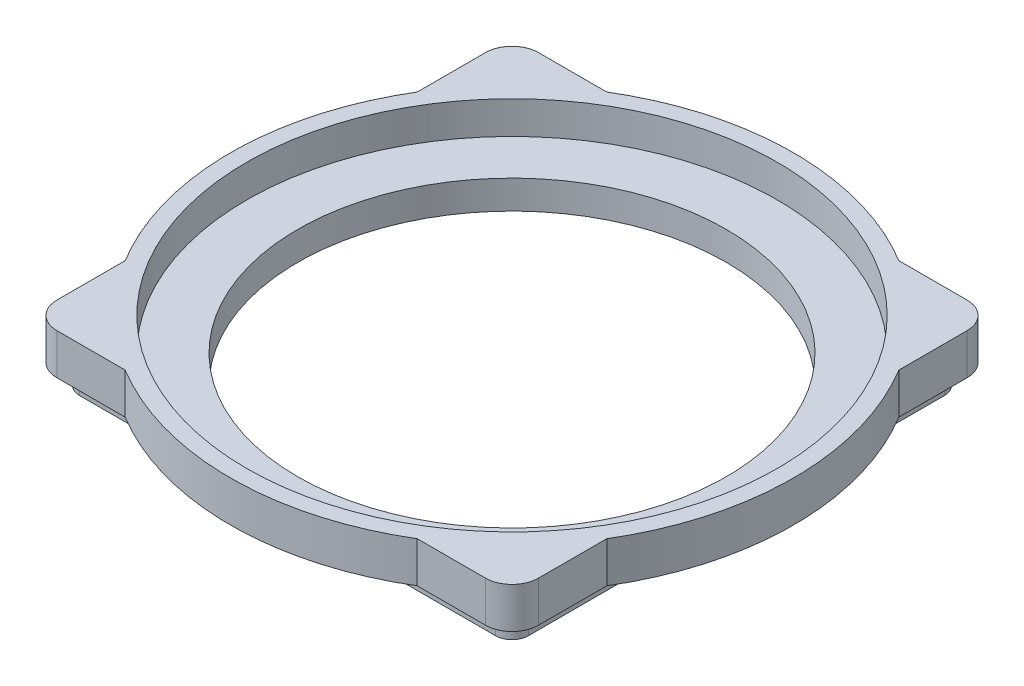
ISO-10303-21;
HEADER;
FILE_DESCRIPTION(('STEP AP214'),'2;1');
FILE_NAME('part.step','',(''),(''),'','','');
FILE_SCHEMA(('AUTOMOTIVE_DESIGN { 1 0 10303 214 1 1 1 1 }'));
ENDSEC;
DATA;
#1=APPLICATION_CONTEXT('core data for automotive mechanical design processes');
#2=APPLICATION_PROTOCOL_DEFINITION('international standard','automotive_design',2000,#1);
#3=PRODUCT_CONTEXT('',#1,'mechanical');
#4=PRODUCT('Part','Part','',(#3));
#5=PRODUCT_RELATED_PRODUCT_CATEGORY('part','',(#4));
#6=PRODUCT_DEFINITION_FORMATION('','',#4);
#7=PRODUCT_DEFINITION_CONTEXT('part definition',#1,'design');
#8=PRODUCT_DEFINITION('design','',#6,#7);
#9=PRODUCT_DEFINITION_SHAPE('','',#8);
#10=(LENGTH_UNIT() NAMED_UNIT(*) SI_UNIT(.MILLI.,.METRE.));
#11=(NAMED_UNIT(*) PLANE_ANGLE_UNIT() SI_UNIT($,.RADIAN.));
#12=(NAMED_UNIT(*) SI_UNIT($,.STERADIAN.) SOLID_ANGLE_UNIT());
#13=UNCERTAINTY_MEASURE_WITH_UNIT(LENGTH_MEASURE(1.E-05),#10,'distance_accuracy_value','');
#14=(GEOMETRIC_REPRESENTATION_CONTEXT(3) GLOBAL_UNCERTAINTY_ASSIGNED_CONTEXT((#13)) GLOBAL_UNIT_ASSIGNED_CONTEXT((#10,
#11,#12)) REPRESENTATION_CONTEXT('',''));
#15=CARTESIAN_POINT('',(0.,0.,0.));
#16=DIRECTION('',(0.,0.,1.));
#17=DIRECTION('',(1.,0.,0.));
#18=AXIS2_PLACEMENT_3D('',#15,#16,#17);
#19=CARTESIAN_POINT('',(0.,0.,0.));
#20=DIRECTION('',(0.,1.,0.));
#21=DIRECTION('',(0.,0.,1.));
#22=AXIS2_PLACEMENT_3D('',#19,#20,#21);
#23=CYLINDRICAL_SURFACE('',#22,52.5);
#24=CARTESIAN_POINT('',(0.,0.,0.));
#25=DIRECTION('',(0.,1.,0.));
#26=DIRECTION('',(0.,0.,1.));
#27=AXIS2_PLACEMENT_3D('',#24,#25,#26);
#28=CIRCLE('',#27,52.5);
#29=CARTESIAN_POINT('',(0.,0.,52.5));
#30=VERTEX_POINT('',#29);
#31=EDGE_CURVE('E257',#30,#30,#28,.T.);
#32=ORIENTED_EDGE('',*,*,#31,.F.);
#33=EDGE_LOOP('',(#32));
#34=FACE_BOUND('',#33,.T.);
#35=CARTESIAN_POINT('',(0.,7.,0.));
#36=DIRECTION('',(0.,1.,0.));
#37=DIRECTION('',(0.,0.,1.));
#38=AXIS2_PLACEMENT_3D('',#35,#36,#37);
#39=CIRCLE('',#38,52.5);
#40=CARTESIAN_POINT('',(0.,7.,52.5));
#41=VERTEX_POINT('',#40);
#42=EDGE_CURVE('E254',#41,#41,#39,.F.);
#43=ORIENTED_EDGE('',*,*,#42,.F.);
#44=EDGE_LOOP('',(#43));
#45=FACE_BOUND('',#44,.T.);
#46=ADVANCED_FACE('F37',(#34,#45),#23,.F.);
#47=CARTESIAN_POINT('',(-59.,15.,-59.));
#48=DIRECTION('',(1.,0.,0.));
#49=DIRECTION('',(0.,0.,-1.));
#50=AXIS2_PLACEMENT_3D('',#47,#48,#49);
#51=PLANE('',#50);
#52=DIRECTION('',(0.,0.,1.));
#53=VECTOR('',#52,1.);
#54=CARTESIAN_POINT('',(-59.,15.,-59.));
#55=LINE('',#54,#53);
#56=CARTESIAN_POINT('',(-59.,15.,-52.5));
#57=VERTEX_POINT('',#56);
#58=CARTESIAN_POINT('',(-59.,15.,-35.7770876399966));
#59=VERTEX_POINT('',#58);
#60=EDGE_CURVE('E242',#57,#59,#55,.T.);
#61=ORIENTED_EDGE('',*,*,#60,.F.);
#62=DIRECTION('',(0.,-1.,0.));
#63=VECTOR('',#62,1.);
#64=CARTESIAN_POINT('',(-59.,15.,-52.5));
#65=LINE('',#64,#63);
#66=CARTESIAN_POINT('',(-59.,5.,-52.5));
#67=VERTEX_POINT('',#66);
#68=EDGE_CURVE('E228',#57,#67,#65,.T.);
#69=ORIENTED_EDGE('',*,*,#68,.T.);
#70=DIRECTION('',(0.,0.,-1.));
#71=VECTOR('',#70,1.);
#72=CARTESIAN_POINT('',(-59.,5.,59.));
#73=LINE('',#72,#71);
#74=CARTESIAN_POINT('',(-59.,5.,-35.7770876399966));
#75=VERTEX_POINT('',#74);
#76=EDGE_CURVE('E218',#75,#67,#73,.T.);
#77=ORIENTED_EDGE('',*,*,#76,.F.);
#78=DIRECTION('',(0.,1.,0.));
#79=VECTOR('',#78,1.);
#80=CARTESIAN_POINT('',(-59.,-190.161471607487,-35.7770876399966));
#81=LINE('',#80,#79);
#82=EDGE_CURVE('E201',#75,#59,#81,.T.);
#83=ORIENTED_EDGE('',*,*,#82,.T.);
#84=EDGE_LOOP('',(#61,#69,#77,#83));
#85=FACE_BOUND('',#84,.T.);
#86=ADVANCED_FACE('F226',(#85),#51,.F.);
#87=CARTESIAN_POINT('',(59.,15.,59.));
#88=DIRECTION('',(0.,0.,-1.));
#89=DIRECTION('',(-1.,0.,0.));
#90=AXIS2_PLACEMENT_3D('',#87,#88,#89);
#91=PLANE('',#90);
#92=DIRECTION('',(1.,0.,0.));
#93=VECTOR('',#92,1.);
#94=CARTESIAN_POINT('',(59.,15.,59.));
#95=LINE('',#94,#93);
#96=CARTESIAN_POINT('',(-52.5,15.,59.));
#97=VERTEX_POINT('',#96);
#98=CARTESIAN_POINT('',(-35.7770876399965,15.,59.));
#99=VERTEX_POINT('',#98);
#100=EDGE_CURVE('E245',#97,#99,#95,.T.);
#101=ORIENTED_EDGE('',*,*,#100,.F.);
#102=DIRECTION('',(0.,-1.,0.));
#103=VECTOR('',#102,1.);
#104=CARTESIAN_POINT('',(-52.5,15.,59.));
#105=LINE('',#104,#103);
#106=CARTESIAN_POINT('',(-52.5,5.,59.));
#107=VERTEX_POINT('',#106);
#108=EDGE_CURVE('E294',#97,#107,#105,.T.);
#109=ORIENTED_EDGE('',*,*,#108,.T.);
#110=DIRECTION('',(-1.,0.,0.));
#111=VECTOR('',#110,1.);
#112=CARTESIAN_POINT('',(59.,5.,59.));
#113=LINE('',#112,#111);
#114=CARTESIAN_POINT('',(-35.7770876399965,5.,59.));
#115=VERTEX_POINT('',#114);
#116=EDGE_CURVE('E232',#115,#107,#113,.T.);
#117=ORIENTED_EDGE('',*,*,#116,.F.);
#118=DIRECTION('',(0.,1.,0.));
#119=VECTOR('',#118,1.);
#120=CARTESIAN_POINT('',(-35.7770876399965,-190.161471607487,59.));
#121=LINE('',#120,#119);
#122=EDGE_CURVE('E354',#115,#99,#121,.T.);
#123=ORIENTED_EDGE('',*,*,#122,.T.);
#124=EDGE_LOOP('',(#101,#109,#117,#123));
#125=FACE_BOUND('',#124,.T.);
#126=ADVANCED_FACE('F433',(#125),#91,.F.);
#127=CARTESIAN_POINT('',(59.,15.,-59.));
#128=DIRECTION('',(-1.,0.,0.));
#129=DIRECTION('',(0.,0.,1.));
#130=AXIS2_PLACEMENT_3D('',#127,#128,#129);
#131=PLANE('',#130);
#132=DIRECTION('',(0.,0.,-1.));
#133=VECTOR('',#132,1.);
#134=CARTESIAN_POINT('',(59.,15.,-59.));
#135=LINE('',#134,#133);
#136=CARTESIAN_POINT('',(59.,15.,52.5));
#137=VERTEX_POINT('',#136);
#138=CARTESIAN_POINT('',(59.,15.,35.7770876399966));
#139=VERTEX_POINT('',#138);
#140=EDGE_CURVE('E248',#137,#139,#135,.T.);
#141=ORIENTED_EDGE('',*,*,#140,.F.);
#142=DIRECTION('',(0.,-1.,0.));
#143=VECTOR('',#142,1.);
#144=CARTESIAN_POINT('',(59.,15.,52.5));
#145=LINE('',#144,#143);
#146=CARTESIAN_POINT('',(59.,5.,52.5));
#147=VERTEX_POINT('',#146);
#148=EDGE_CURVE('E316',#137,#147,#145,.T.);
#149=ORIENTED_EDGE('',*,*,#148,.T.);
#150=DIRECTION('',(0.,0.,1.));
#151=VECTOR('',#150,1.);
#152=CARTESIAN_POINT('',(59.,5.,-59.));
#153=LINE('',#152,#151);
#154=CARTESIAN_POINT('',(59.,5.,35.7770876399966));
#155=VERTEX_POINT('',#154);
#156=EDGE_CURVE('E238',#155,#147,#153,.T.);
#157=ORIENTED_EDGE('',*,*,#156,.F.);
#158=DIRECTION('',(0.,1.,0.));
#159=VECTOR('',#158,1.);
#160=CARTESIAN_POINT('',(59.,-190.161471607487,35.7770876399966));
#161=LINE('',#160,#159);
#162=EDGE_CURVE('E348',#155,#139,#161,.T.);
#163=ORIENTED_EDGE('',*,*,#162,.T.);
#164=EDGE_LOOP('',(#141,#149,#157,#163));
#165=FACE_BOUND('',#164,.T.);
#166=ADVANCED_FACE('F471',(#165),#131,.F.);
#167=CARTESIAN_POINT('',(59.,15.,-59.));
#168=DIRECTION('',(0.,0.,1.));
#169=DIRECTION('',(1.,0.,0.));
#170=AXIS2_PLACEMENT_3D('',#167,#168,#169);
#171=PLANE('',#170);
#172=DIRECTION('',(-1.,0.,0.));
#173=VECTOR('',#172,1.);
#174=CARTESIAN_POINT('',(59.,15.,-59.));
#175=LINE('',#174,#173);
#176=CARTESIAN_POINT('',(52.5,15.,-59.));
#177=VERTEX_POINT('',#176);
#178=CARTESIAN_POINT('',(35.7770876399966,15.,-59.));
#179=VERTEX_POINT('',#178);
#180=EDGE_CURVE('E251',#177,#179,#175,.T.);
#181=ORIENTED_EDGE('',*,*,#180,.F.);
#182=DIRECTION('',(0.,-1.,0.));
#183=VECTOR('',#182,1.);
#184=CARTESIAN_POINT('',(52.5,15.,-59.));
#185=LINE('',#184,#183);
#186=CARTESIAN_POINT('',(52.5,5.,-59.));
#187=VERTEX_POINT('',#186);
#188=EDGE_CURVE('E45',#177,#187,#185,.T.);
#189=ORIENTED_EDGE('',*,*,#188,.T.);
#190=DIRECTION('',(1.,0.,0.));
#191=VECTOR('',#190,1.);
#192=CARTESIAN_POINT('',(-59.,5.,-59.));
#193=LINE('',#192,#191);
#194=CARTESIAN_POINT('',(35.7770876399966,5.,-59.));
#195=VERTEX_POINT('',#194);
#196=EDGE_CURVE('E231',#195,#187,#193,.T.);
#197=ORIENTED_EDGE('',*,*,#196,.F.);
#198=DIRECTION('',(0.,1.,0.));
#199=VECTOR('',#198,1.);
#200=CARTESIAN_POINT('',(35.7770876399966,-190.161471607487,-59.));
#201=LINE('',#200,#199);
#202=EDGE_CURVE('E343',#195,#179,#201,.T.);
#203=ORIENTED_EDGE('',*,*,#202,.T.);
#204=EDGE_LOOP('',(#181,#189,#197,#203));
#205=FACE_BOUND('',#204,.T.);
#206=ADVANCED_FACE('F325',(#205),#171,.F.);
#207=CARTESIAN_POINT('',(-59.,5.,52.5000000000001));
#208=VERTEX_POINT('',#207);
#209=CARTESIAN_POINT('',(-59.,5.,35.7770876399966));
#210=VERTEX_POINT('',#209);
#211=EDGE_CURVE('E220',#208,#210,#73,.T.);
#212=ORIENTED_EDGE('',*,*,#211,.F.);
#213=DIRECTION('',(0.,-1.,0.));
#214=VECTOR('',#213,1.);
#215=CARTESIAN_POINT('',(-59.,15.,52.5));
#216=LINE('',#215,#214);
#217=CARTESIAN_POINT('',(-59.,15.,52.5));
#218=VERTEX_POINT('',#217);
#219=EDGE_CURVE('E305',#208,#218,#216,.F.);
#220=ORIENTED_EDGE('',*,*,#219,.T.);
#221=CARTESIAN_POINT('',(-59.,15.,35.7770876399966));
#222=VERTEX_POINT('',#221);
#223=EDGE_CURVE('E241',#222,#218,#55,.T.);
#224=ORIENTED_EDGE('',*,*,#223,.F.);
#225=DIRECTION('',(0.,1.,0.));
#226=VECTOR('',#225,1.);
#227=CARTESIAN_POINT('',(-59.,-190.161471607487,35.7770876399966));
#228=LINE('',#227,#226);
#229=EDGE_CURVE('E212',#222,#210,#228,.F.);
#230=ORIENTED_EDGE('',*,*,#229,.T.);
#231=EDGE_LOOP('',(#212,#220,#224,#230));
#232=FACE_BOUND('',#231,.T.);
#233=ADVANCED_FACE('F435',(#232),#51,.F.);
#234=CARTESIAN_POINT('',(52.5,5.,59.));
#235=VERTEX_POINT('',#234);
#236=CARTESIAN_POINT('',(35.7770876399966,5.,59.));
#237=VERTEX_POINT('',#236);
#238=EDGE_CURVE('E229',#235,#237,#113,.T.);
#239=ORIENTED_EDGE('',*,*,#238,.F.);
#240=DIRECTION('',(0.,-1.,0.));
#241=VECTOR('',#240,1.);
#242=CARTESIAN_POINT('',(52.5,15.,59.));
#243=LINE('',#242,#241);
#244=CARTESIAN_POINT('',(52.5,15.,59.));
#245=VERTEX_POINT('',#244);
#246=EDGE_CURVE('E319',#235,#245,#243,.F.);
#247=ORIENTED_EDGE('',*,*,#246,.T.);
#248=CARTESIAN_POINT('',(35.7770876399966,15.,59.));
#249=VERTEX_POINT('',#248);
#250=EDGE_CURVE('E244',#249,#245,#95,.T.);
#251=ORIENTED_EDGE('',*,*,#250,.F.);
#252=DIRECTION('',(0.,1.,0.));
#253=VECTOR('',#252,1.);
#254=CARTESIAN_POINT('',(35.7770876399966,-190.161471607487,59.));
#255=LINE('',#254,#253);
#256=EDGE_CURVE('E351',#249,#237,#255,.F.);
#257=ORIENTED_EDGE('',*,*,#256,.T.);
#258=EDGE_LOOP('',(#239,#247,#251,#257));
#259=FACE_BOUND('',#258,.T.);
#260=ADVANCED_FACE('F469',(#259),#91,.F.);
#261=CARTESIAN_POINT('',(59.,5.,-52.5));
#262=VERTEX_POINT('',#261);
#263=CARTESIAN_POINT('',(59.,5.,-35.7770876399966));
#264=VERTEX_POINT('',#263);
#265=EDGE_CURVE('E239',#262,#264,#153,.T.);
#266=ORIENTED_EDGE('',*,*,#265,.F.);
#267=DIRECTION('',(0.,-1.,0.));
#268=VECTOR('',#267,1.);
#269=CARTESIAN_POINT('',(59.,15.,-52.5));
#270=LINE('',#269,#268);
#271=CARTESIAN_POINT('',(59.,15.,-52.5));
#272=VERTEX_POINT('',#271);
#273=EDGE_CURVE('E11',#262,#272,#270,.F.);
#274=ORIENTED_EDGE('',*,*,#273,.T.);
#275=CARTESIAN_POINT('',(59.,15.,-35.7770876399966));
#276=VERTEX_POINT('',#275);
#277=EDGE_CURVE('E247',#276,#272,#135,.T.);
#278=ORIENTED_EDGE('',*,*,#277,.F.);
#279=DIRECTION('',(0.,1.,0.));
#280=VECTOR('',#279,1.);
#281=CARTESIAN_POINT('',(59.,-190.161471607487,-35.7770876399966));
#282=LINE('',#281,#280);
#283=EDGE_CURVE('E345',#276,#264,#282,.F.);
#284=ORIENTED_EDGE('',*,*,#283,.T.);
#285=EDGE_LOOP('',(#266,#274,#278,#284));
#286=FACE_BOUND('',#285,.T.);
#287=ADVANCED_FACE('F466',(#286),#131,.F.);
#288=CARTESIAN_POINT('',(-52.5,5.,-59.));
#289=VERTEX_POINT('',#288);
#290=CARTESIAN_POINT('',(-35.7770876399967,5.,-59.));
#291=VERTEX_POINT('',#290);
#292=EDGE_CURVE('E236',#289,#291,#193,.T.);
#293=ORIENTED_EDGE('',*,*,#292,.F.);
#294=DIRECTION('',(0.,-1.,0.));
#295=VECTOR('',#294,1.);
#296=CARTESIAN_POINT('',(-52.5,15.,-59.));
#297=LINE('',#296,#295);
#298=CARTESIAN_POINT('',(-52.5,15.,-59.));
#299=VERTEX_POINT('',#298);
#300=EDGE_CURVE('E52',#289,#299,#297,.F.);
#301=ORIENTED_EDGE('',*,*,#300,.T.);
#302=CARTESIAN_POINT('',(-35.7770876399967,15.,-59.));
#303=VERTEX_POINT('',#302);
#304=EDGE_CURVE('E250',#303,#299,#175,.T.);
#305=ORIENTED_EDGE('',*,*,#304,.F.);
#306=DIRECTION('',(0.,1.,0.));
#307=VECTOR('',#306,1.);
#308=CARTESIAN_POINT('',(-35.7770876399967,-190.161471607487,-59.));
#309=LINE('',#308,#307);
#310=EDGE_CURVE('E221',#303,#291,#309,.F.);
#311=ORIENTED_EDGE('',*,*,#310,.T.);
#312=EDGE_LOOP('',(#293,#301,#305,#311));
#313=FACE_BOUND('',#312,.T.);
#314=ADVANCED_FACE('F459',(#313),#171,.F.);
#315=CARTESIAN_POINT('',(0.,15.,0.));
#316=DIRECTION('',(0.,-1.,0.));
#317=DIRECTION('',(0.,0.,-1.));
#318=AXIS2_PLACEMENT_3D('',#315,#316,#317);
#319=PLANE('',#318);
#320=CARTESIAN_POINT('',(0.,15.,0.));
#321=DIRECTION('',(0.,1.,0.));
#322=DIRECTION('',(0.,0.,1.));
#323=AXIS2_PLACEMENT_3D('',#320,#321,#322);
#324=CIRCLE('',#323,65.);
#325=CARTESIAN_POINT('',(0.,15.,65.));
#326=VERTEX_POINT('',#325);
#327=EDGE_CURVE('E715',#326,#326,#324,.T.);
#328=ORIENTED_EDGE('',*,*,#327,.F.);
#329=EDGE_LOOP('',(#328));
#330=FACE_BOUND('',#329,.T.);
#331=ORIENTED_EDGE('',*,*,#223,.T.);
#332=CARTESIAN_POINT('',(-52.5,15.,52.5000000000001));
#333=DIRECTION('',(0.,-1.,0.));
#334=DIRECTION('',(0.,0.,-1.));
#335=AXIS2_PLACEMENT_3D('',#332,#333,#334);
#336=CIRCLE('',#335,6.5);
#337=EDGE_CURVE('E312',#218,#97,#336,.F.);
#338=ORIENTED_EDGE('',*,*,#337,.T.);
#339=ORIENTED_EDGE('',*,*,#100,.T.);
#340=CARTESIAN_POINT('',(0.,15.,0.));
#341=DIRECTION('',(0.,1.,0.));
#342=DIRECTION('',(0.,0.,1.));
#343=AXIS2_PLACEMENT_3D('',#340,#341,#342);
#344=CIRCLE('',#343,69.);
#345=EDGE_CURVE('E339',#99,#249,#344,.T.);
#346=ORIENTED_EDGE('',*,*,#345,.T.);
#347=ORIENTED_EDGE('',*,*,#250,.T.);
#348=CARTESIAN_POINT('',(52.5,15.,52.5));
#349=DIRECTION('',(0.,-1.,0.));
#350=DIRECTION('',(0.,0.,-1.));
#351=AXIS2_PLACEMENT_3D('',#348,#349,#350);
#352=CIRCLE('',#351,6.5);
#353=EDGE_CURVE('E308',#245,#137,#352,.F.);
#354=ORIENTED_EDGE('',*,*,#353,.T.);
#355=ORIENTED_EDGE('',*,*,#140,.T.);
#356=EDGE_CURVE('E334',#139,#276,#344,.T.);
#357=ORIENTED_EDGE('',*,*,#356,.T.);
#358=ORIENTED_EDGE('',*,*,#277,.T.);
#359=CARTESIAN_POINT('',(52.5,15.,-52.5));
#360=DIRECTION('',(0.,-1.,0.));
#361=DIRECTION('',(0.,0.,-1.));
#362=AXIS2_PLACEMENT_3D('',#359,#360,#361);
#363=CIRCLE('',#362,6.5);
#364=EDGE_CURVE('E60',#272,#177,#363,.F.);
#365=ORIENTED_EDGE('',*,*,#364,.T.);
#366=ORIENTED_EDGE('',*,*,#180,.T.);
#367=EDGE_CURVE('E337',#179,#303,#344,.T.);
#368=ORIENTED_EDGE('',*,*,#367,.T.);
#369=ORIENTED_EDGE('',*,*,#304,.T.);
#370=CARTESIAN_POINT('',(-52.5,15.,-52.5));
#371=DIRECTION('',(0.,-1.,0.));
#372=DIRECTION('',(0.,0.,-1.));
#373=AXIS2_PLACEMENT_3D('',#370,#371,#372);
#374=CIRCLE('',#373,6.5);
#375=EDGE_CURVE('E310',#299,#57,#374,.F.);
#376=ORIENTED_EDGE('',*,*,#375,.T.);
#377=ORIENTED_EDGE('',*,*,#60,.T.);
#378=EDGE_CURVE('E207',#59,#222,#344,.T.);
#379=ORIENTED_EDGE('',*,*,#378,.T.);
#380=EDGE_LOOP('',(#331,#338,#339,#346,#347,#354,#355,#357,#358,#365,#366,#368,#369,#376,#377,#379));
#381=FACE_BOUND('',#380,.T.);
#382=ADVANCED_FACE('F456',(#330,#381),#319,.F.);
#383=CARTESIAN_POINT('',(0.,5.,0.));
#384=DIRECTION('',(0.,-1.,0.));
#385=DIRECTION('',(0.,0.,-1.));
#386=AXIS2_PLACEMENT_3D('',#383,#384,#385);
#387=PLANE('',#386);
#388=DIRECTION('',(0.,0.,1.));
#389=VECTOR('',#388,1.);
#390=CARTESIAN_POINT('',(55.,5.,-55.));
#391=LINE('',#390,#389);
#392=CARTESIAN_POINT('',(55.,5.,-51.));
#393=VERTEX_POINT('',#392);
#394=CARTESIAN_POINT('',(55.,5.,51.));
#395=VERTEX_POINT('',#394);
#396=EDGE_CURVE('E358',#393,#395,#391,.T.);
#397=ORIENTED_EDGE('',*,*,#396,.F.);
#398=CARTESIAN_POINT('',(51.,5.,-51.));
#399=DIRECTION('',(0.,-1.,0.));
#400=DIRECTION('',(0.,0.,-1.));
#401=AXIS2_PLACEMENT_3D('',#398,#399,#400);
#402=CIRCLE('',#401,4.);
#403=CARTESIAN_POINT('',(51.,5.,-55.));
#404=VERTEX_POINT('',#403);
#405=EDGE_CURVE('E288',#393,#404,#402,.F.);
#406=ORIENTED_EDGE('',*,*,#405,.T.);
#407=DIRECTION('',(1.,0.,0.));
#408=VECTOR('',#407,1.);
#409=CARTESIAN_POINT('',(-55.,5.,-55.));
#410=LINE('',#409,#408);
#411=CARTESIAN_POINT('',(-51.,5.,-55.));
#412=VERTEX_POINT('',#411);
#413=EDGE_CURVE('E368',#412,#404,#410,.T.);
#414=ORIENTED_EDGE('',*,*,#413,.F.);
#415=CARTESIAN_POINT('',(-51.,5.,-51.));
#416=DIRECTION('',(0.,-1.,0.));
#417=DIRECTION('',(0.,0.,-1.));
#418=AXIS2_PLACEMENT_3D('',#415,#416,#417);
#419=CIRCLE('',#418,4.);
#420=CARTESIAN_POINT('',(-55.,5.,-51.));
#421=VERTEX_POINT('',#420);
#422=EDGE_CURVE('E286',#412,#421,#419,.F.);
#423=ORIENTED_EDGE('',*,*,#422,.T.);
#424=DIRECTION('',(0.,0.,-1.));
#425=VECTOR('',#424,1.);
#426=CARTESIAN_POINT('',(-55.,5.,-55.));
#427=LINE('',#426,#425);
#428=CARTESIAN_POINT('',(-55.,5.,51.));
#429=VERTEX_POINT('',#428);
#430=EDGE_CURVE('E365',#429,#421,#427,.T.);
#431=ORIENTED_EDGE('',*,*,#430,.F.);
#432=CARTESIAN_POINT('',(-51.,5.,51.));
#433=DIRECTION('',(0.,-1.,0.));
#434=DIRECTION('',(0.,0.,-1.));
#435=AXIS2_PLACEMENT_3D('',#432,#433,#434);
#436=CIRCLE('',#435,4.);
#437=CARTESIAN_POINT('',(-51.,5.,55.));
#438=VERTEX_POINT('',#437);
#439=EDGE_CURVE('E292',#429,#438,#436,.F.);
#440=ORIENTED_EDGE('',*,*,#439,.T.);
#441=DIRECTION('',(-1.,0.,0.));
#442=VECTOR('',#441,1.);
#443=CARTESIAN_POINT('',(-55.,5.,55.));
#444=LINE('',#443,#442);
#445=CARTESIAN_POINT('',(51.,5.,55.));
#446=VERTEX_POINT('',#445);
#447=EDGE_CURVE('E361',#446,#438,#444,.T.);
#448=ORIENTED_EDGE('',*,*,#447,.F.);
#449=CARTESIAN_POINT('',(51.,5.,51.));
#450=DIRECTION('',(0.,-1.,0.));
#451=DIRECTION('',(0.,0.,-1.));
#452=AXIS2_PLACEMENT_3D('',#449,#450,#451);
#453=CIRCLE('',#452,4.);
#454=EDGE_CURVE('E290',#446,#395,#453,.F.);
#455=ORIENTED_EDGE('',*,*,#454,.T.);
#456=EDGE_LOOP('',(#397,#406,#414,#423,#431,#440,#448,#455));
#457=FACE_BOUND('',#456,.T.);
#458=ORIENTED_EDGE('',*,*,#116,.T.);
#459=CARTESIAN_POINT('',(-52.5,5.,52.5000000000001));
#460=DIRECTION('',(0.,-1.,0.));
#461=DIRECTION('',(0.,0.,-1.));
#462=AXIS2_PLACEMENT_3D('',#459,#460,#461);
#463=CIRCLE('',#462,6.5);
#464=EDGE_CURVE('E303',#107,#208,#463,.T.);
#465=ORIENTED_EDGE('',*,*,#464,.T.);
#466=ORIENTED_EDGE('',*,*,#211,.T.);
#467=CARTESIAN_POINT('',(0.,5.,0.));
#468=DIRECTION('',(0.,-1.,0.));
#469=DIRECTION('',(0.,0.,-1.));
#470=AXIS2_PLACEMENT_3D('',#467,#468,#469);
#471=CIRCLE('',#470,69.);
#472=EDGE_CURVE('E204',#75,#210,#471,.F.);
#473=ORIENTED_EDGE('',*,*,#472,.F.);
#474=ORIENTED_EDGE('',*,*,#76,.T.);
#475=CARTESIAN_POINT('',(-52.5,5.,-52.5));
#476=DIRECTION('',(0.,-1.,0.));
#477=DIRECTION('',(0.,0.,-1.));
#478=AXIS2_PLACEMENT_3D('',#475,#476,#477);
#479=CIRCLE('',#478,6.5);
#480=EDGE_CURVE('E301',#67,#289,#479,.T.);
#481=ORIENTED_EDGE('',*,*,#480,.T.);
#482=ORIENTED_EDGE('',*,*,#292,.T.);
#483=EDGE_CURVE('E224',#195,#291,#471,.F.);
#484=ORIENTED_EDGE('',*,*,#483,.F.);
#485=ORIENTED_EDGE('',*,*,#196,.T.);
#486=CARTESIAN_POINT('',(52.5,5.,-52.5));
#487=DIRECTION('',(0.,-1.,0.));
#488=DIRECTION('',(0.,0.,-1.));
#489=AXIS2_PLACEMENT_3D('',#486,#487,#488);
#490=CIRCLE('',#489,6.5);
#491=EDGE_CURVE('E297',#187,#262,#490,.T.);
#492=ORIENTED_EDGE('',*,*,#491,.T.);
#493=ORIENTED_EDGE('',*,*,#265,.T.);
#494=EDGE_CURVE('E333',#155,#264,#471,.F.);
#495=ORIENTED_EDGE('',*,*,#494,.F.);
#496=ORIENTED_EDGE('',*,*,#156,.T.);
#497=CARTESIAN_POINT('',(52.5,5.,52.5));
#498=DIRECTION('',(0.,-1.,0.));
#499=DIRECTION('',(0.,0.,-1.));
#500=AXIS2_PLACEMENT_3D('',#497,#498,#499);
#501=CIRCLE('',#500,6.5);
#502=EDGE_CURVE('E299',#147,#235,#501,.T.);
#503=ORIENTED_EDGE('',*,*,#502,.T.);
#504=ORIENTED_EDGE('',*,*,#238,.T.);
#505=EDGE_CURVE('E222',#115,#237,#471,.F.);
#506=ORIENTED_EDGE('',*,*,#505,.F.);
#507=EDGE_LOOP('',(#458,#465,#466,#473,#474,#481,#482,#484,#485,#492,#493,#495,#496,#503,#504,#506));
#508=FACE_BOUND('',#507,.T.);
#509=ADVANCED_FACE('F217',(#457,#508),#387,.T.);
#510=CARTESIAN_POINT('',(55.,5.,-55.));
#511=DIRECTION('',(1.,0.,0.));
#512=DIRECTION('',(0.,0.,-1.));
#513=AXIS2_PLACEMENT_3D('',#510,#511,#512);
#514=PLANE('',#513);
#515=DIRECTION('',(0.,0.,1.));
#516=VECTOR('',#515,1.);
#517=CARTESIAN_POINT('',(55.,0.,-55.));
#518=LINE('',#517,#516);
#519=CARTESIAN_POINT('',(55.,0.,-51.));
#520=VERTEX_POINT('',#519);
#521=CARTESIAN_POINT('',(55.,0.,51.));
#522=VERTEX_POINT('',#521);
#523=EDGE_CURVE('E211',#520,#522,#518,.T.);
#524=ORIENTED_EDGE('',*,*,#523,.F.);
#525=DIRECTION('',(0.,-1.,0.));
#526=VECTOR('',#525,1.);
#527=CARTESIAN_POINT('',(55.,5.,-51.));
#528=LINE('',#527,#526);
#529=EDGE_CURVE('E279',#520,#393,#528,.F.);
#530=ORIENTED_EDGE('',*,*,#529,.T.);
#531=ORIENTED_EDGE('',*,*,#396,.T.);
#532=DIRECTION('',(0.,-1.,0.));
#533=VECTOR('',#532,1.);
#534=CARTESIAN_POINT('',(55.,5.,51.));
#535=LINE('',#534,#533);
#536=EDGE_CURVE('E276',#395,#522,#535,.T.);
#537=ORIENTED_EDGE('',*,*,#536,.T.);
#538=EDGE_LOOP('',(#524,#530,#531,#537));
#539=FACE_BOUND('',#538,.T.);
#540=ADVANCED_FACE('F414',(#539),#514,.T.);
#541=CARTESIAN_POINT('',(-55.,5.,-55.));
#542=DIRECTION('',(0.,0.,-1.));
#543=DIRECTION('',(-1.,0.,0.));
#544=AXIS2_PLACEMENT_3D('',#541,#542,#543);
#545=PLANE('',#544);
#546=DIRECTION('',(1.,0.,0.));
#547=VECTOR('',#546,1.);
#548=CARTESIAN_POINT('',(-55.,0.,-55.));
#549=LINE('',#548,#547);
#550=CARTESIAN_POINT('',(-51.,0.,-55.));
#551=VERTEX_POINT('',#550);
#552=CARTESIAN_POINT('',(51.,0.,-55.));
#553=VERTEX_POINT('',#552);
#554=EDGE_CURVE('E362',#551,#553,#549,.T.);
#555=ORIENTED_EDGE('',*,*,#554,.F.);
#556=DIRECTION('',(0.,-1.,0.));
#557=VECTOR('',#556,1.);
#558=CARTESIAN_POINT('',(-51.,5.,-55.));
#559=LINE('',#558,#557);
#560=EDGE_CURVE('E274',#551,#412,#559,.F.);
#561=ORIENTED_EDGE('',*,*,#560,.T.);
#562=ORIENTED_EDGE('',*,*,#413,.T.);
#563=DIRECTION('',(0.,-1.,0.));
#564=VECTOR('',#563,1.);
#565=CARTESIAN_POINT('',(51.,5.,-55.));
#566=LINE('',#565,#564);
#567=EDGE_CURVE('E271',#404,#553,#566,.T.);
#568=ORIENTED_EDGE('',*,*,#567,.T.);
#569=EDGE_LOOP('',(#555,#561,#562,#568));
#570=FACE_BOUND('',#569,.T.);
#571=ADVANCED_FACE('F385',(#570),#545,.T.);
#572=CARTESIAN_POINT('',(-55.,5.,-55.));
#573=DIRECTION('',(-1.,0.,0.));
#574=DIRECTION('',(0.,0.,1.));
#575=AXIS2_PLACEMENT_3D('',#572,#573,#574);
#576=PLANE('',#575);
#577=ORIENTED_EDGE('',*,*,#430,.T.);
#578=DIRECTION('',(0.,-1.,0.));
#579=VECTOR('',#578,1.);
#580=CARTESIAN_POINT('',(-55.,5.,-51.));
#581=LINE('',#580,#579);
#582=CARTESIAN_POINT('',(-55.,0.,-51.));
#583=VERTEX_POINT('',#582);
#584=EDGE_CURVE('E260',#421,#583,#581,.T.);
#585=ORIENTED_EDGE('',*,*,#584,.T.);
#586=DIRECTION('',(0.,0.,-1.));
#587=VECTOR('',#586,1.);
#588=CARTESIAN_POINT('',(-55.,0.,-55.));
#589=LINE('',#588,#587);
#590=CARTESIAN_POINT('',(-55.,0.,51.));
#591=VERTEX_POINT('',#590);
#592=EDGE_CURVE('E376',#591,#583,#589,.T.);
#593=ORIENTED_EDGE('',*,*,#592,.F.);
#594=DIRECTION('',(0.,-1.,0.));
#595=VECTOR('',#594,1.);
#596=CARTESIAN_POINT('',(-55.,5.,51.));
#597=LINE('',#596,#595);
#598=EDGE_CURVE('E253',#591,#429,#597,.F.);
#599=ORIENTED_EDGE('',*,*,#598,.T.);
#600=EDGE_LOOP('',(#577,#585,#593,#599));
#601=FACE_BOUND('',#600,.T.);
#602=ADVANCED_FACE('F397',(#601),#576,.T.);
#603=CARTESIAN_POINT('',(-55.,5.,55.));
#604=DIRECTION('',(0.,0.,1.));
#605=DIRECTION('',(1.,0.,0.));
#606=AXIS2_PLACEMENT_3D('',#603,#604,#605);
#607=PLANE('',#606);
#608=DIRECTION('',(-1.,0.,0.));
#609=VECTOR('',#608,1.);
#610=CARTESIAN_POINT('',(-55.,0.,55.));
#611=LINE('',#610,#609);
#612=CARTESIAN_POINT('',(51.,0.,55.));
#613=VERTEX_POINT('',#612);
#614=CARTESIAN_POINT('',(-51.,0.,55.));
#615=VERTEX_POINT('',#614);
#616=EDGE_CURVE('E373',#613,#615,#611,.T.);
#617=ORIENTED_EDGE('',*,*,#616,.F.);
#618=DIRECTION('',(0.,-1.,0.));
#619=VECTOR('',#618,1.);
#620=CARTESIAN_POINT('',(51.,5.,55.));
#621=LINE('',#620,#619);
#622=EDGE_CURVE('E284',#613,#446,#621,.F.);
#623=ORIENTED_EDGE('',*,*,#622,.T.);
#624=ORIENTED_EDGE('',*,*,#447,.T.);
#625=DIRECTION('',(0.,-1.,0.));
#626=VECTOR('',#625,1.);
#627=CARTESIAN_POINT('',(-51.,5.,55.));
#628=LINE('',#627,#626);
#629=EDGE_CURVE('E281',#438,#615,#628,.T.);
#630=ORIENTED_EDGE('',*,*,#629,.T.);
#631=EDGE_LOOP('',(#617,#623,#624,#630));
#632=FACE_BOUND('',#631,.T.);
#633=ADVANCED_FACE('F407',(#632),#607,.T.);
#634=CARTESIAN_POINT('',(0.,0.,0.));
#635=DIRECTION('',(0.,-1.,0.));
#636=DIRECTION('',(0.,0.,-1.));
#637=AXIS2_PLACEMENT_3D('',#634,#635,#636);
#638=PLANE('',#637);
#639=ORIENTED_EDGE('',*,*,#31,.T.);
#640=EDGE_LOOP('',(#639));
#641=FACE_BOUND('',#640,.T.);
#642=ORIENTED_EDGE('',*,*,#592,.T.);
#643=CARTESIAN_POINT('',(-51.,0.,-51.));
#644=DIRECTION('',(0.,-1.,0.));
#645=DIRECTION('',(0.,0.,-1.));
#646=AXIS2_PLACEMENT_3D('',#643,#644,#645);
#647=CIRCLE('',#646,4.);
#648=EDGE_CURVE('E269',#583,#551,#647,.T.);
#649=ORIENTED_EDGE('',*,*,#648,.T.);
#650=ORIENTED_EDGE('',*,*,#554,.T.);
#651=CARTESIAN_POINT('',(51.,0.,-51.));
#652=DIRECTION('',(0.,-1.,0.));
#653=DIRECTION('',(0.,0.,-1.));
#654=AXIS2_PLACEMENT_3D('',#651,#652,#653);
#655=CIRCLE('',#654,4.);
#656=EDGE_CURVE('E267',#553,#520,#655,.T.);
#657=ORIENTED_EDGE('',*,*,#656,.T.);
#658=ORIENTED_EDGE('',*,*,#523,.T.);
#659=CARTESIAN_POINT('',(51.,0.,51.));
#660=DIRECTION('',(0.,-1.,0.));
#661=DIRECTION('',(0.,0.,-1.));
#662=AXIS2_PLACEMENT_3D('',#659,#660,#661);
#663=CIRCLE('',#662,4.);
#664=EDGE_CURVE('E265',#522,#613,#663,.T.);
#665=ORIENTED_EDGE('',*,*,#664,.T.);
#666=ORIENTED_EDGE('',*,*,#616,.T.);
#667=CARTESIAN_POINT('',(-51.,0.,51.));
#668=DIRECTION('',(0.,-1.,0.));
#669=DIRECTION('',(0.,0.,-1.));
#670=AXIS2_PLACEMENT_3D('',#667,#668,#669);
#671=CIRCLE('',#670,4.);
#672=EDGE_CURVE('E263',#615,#591,#671,.T.);
#673=ORIENTED_EDGE('',*,*,#672,.T.);
#674=EDGE_LOOP('',(#642,#649,#650,#657,#658,#665,#666,#673));
#675=FACE_BOUND('',#674,.T.);
#676=ADVANCED_FACE('F381',(#641,#675),#638,.T.);
#677=CARTESIAN_POINT('',(0.,-190.161471607487,0.));
#678=DIRECTION('',(0.,1.,0.));
#679=DIRECTION('',(0.,0.,1.));
#680=AXIS2_PLACEMENT_3D('',#677,#678,#679);
#681=CYLINDRICAL_SURFACE('',#680,69.);
#682=ORIENTED_EDGE('',*,*,#202,.F.);
#683=ORIENTED_EDGE('',*,*,#483,.T.);
#684=ORIENTED_EDGE('',*,*,#310,.F.);
#685=ORIENTED_EDGE('',*,*,#367,.F.);
#686=EDGE_LOOP('',(#682,#683,#684,#685));
#687=FACE_BOUND('',#686,.T.);
#688=ADVANCED_FACE('F445',(#687),#681,.T.);
#689=ORIENTED_EDGE('',*,*,#162,.F.);
#690=ORIENTED_EDGE('',*,*,#494,.T.);
#691=ORIENTED_EDGE('',*,*,#283,.F.);
#692=ORIENTED_EDGE('',*,*,#356,.F.);
#693=EDGE_LOOP('',(#689,#690,#691,#692));
#694=FACE_BOUND('',#693,.T.);
#695=ADVANCED_FACE('F509',(#694),#681,.T.);
#696=ORIENTED_EDGE('',*,*,#122,.F.);
#697=ORIENTED_EDGE('',*,*,#505,.T.);
#698=ORIENTED_EDGE('',*,*,#256,.F.);
#699=ORIENTED_EDGE('',*,*,#345,.F.);
#700=EDGE_LOOP('',(#696,#697,#698,#699));
#701=FACE_BOUND('',#700,.T.);
#702=ADVANCED_FACE('F444',(#701),#681,.T.);
#703=ORIENTED_EDGE('',*,*,#82,.F.);
#704=ORIENTED_EDGE('',*,*,#472,.T.);
#705=ORIENTED_EDGE('',*,*,#229,.F.);
#706=ORIENTED_EDGE('',*,*,#378,.F.);
#707=EDGE_LOOP('',(#703,#704,#705,#706));
#708=FACE_BOUND('',#707,.T.);
#709=ADVANCED_FACE('F203',(#708),#681,.T.);
#710=CARTESIAN_POINT('',(0.,7.,0.));
#711=DIRECTION('',(0.,1.,0.));
#712=DIRECTION('',(0.,0.,1.));
#713=AXIS2_PLACEMENT_3D('',#710,#711,#712);
#714=PLANE('',#713);
#715=CARTESIAN_POINT('',(0.,7.,0.));
#716=DIRECTION('',(0.,1.,0.));
#717=DIRECTION('',(0.,0.,1.));
#718=AXIS2_PLACEMENT_3D('',#715,#716,#717);
#719=CIRCLE('',#718,65.);
#720=CARTESIAN_POINT('',(0.,7.,65.));
#721=VERTEX_POINT('',#720);
#722=EDGE_CURVE('E258',#721,#721,#719,.T.);
#723=ORIENTED_EDGE('',*,*,#722,.T.);
#724=EDGE_LOOP('',(#723));
#725=FACE_BOUND('',#724,.T.);
#726=ORIENTED_EDGE('',*,*,#42,.T.);
#727=EDGE_LOOP('',(#726));
#728=FACE_BOUND('',#727,.T.);
#729=ADVANCED_FACE('F443',(#725,#728),#714,.T.);
#730=CARTESIAN_POINT('',(0.,7.,0.));
#731=DIRECTION('',(0.,1.,0.));
#732=DIRECTION('',(0.,0.,1.));
#733=AXIS2_PLACEMENT_3D('',#730,#731,#732);
#734=CYLINDRICAL_SURFACE('',#733,65.);
#735=ORIENTED_EDGE('',*,*,#722,.F.);
#736=EDGE_LOOP('',(#735));
#737=FACE_BOUND('',#736,.T.);
#738=ORIENTED_EDGE('',*,*,#327,.T.);
#739=EDGE_LOOP('',(#738));
#740=FACE_BOUND('',#739,.T.);
#741=ADVANCED_FACE('F425',(#737,#740),#734,.F.);
#742=CARTESIAN_POINT('',(-51.,5.,-51.));
#743=DIRECTION('',(0.,-1.,0.));
#744=DIRECTION('',(0.,0.,-1.));
#745=AXIS2_PLACEMENT_3D('',#742,#743,#744);
#746=CYLINDRICAL_SURFACE('',#745,4.);
#747=ORIENTED_EDGE('',*,*,#422,.F.);
#748=ORIENTED_EDGE('',*,*,#560,.F.);
#749=ORIENTED_EDGE('',*,*,#648,.F.);
#750=ORIENTED_EDGE('',*,*,#584,.F.);
#751=EDGE_LOOP('',(#747,#748,#749,#750));
#752=FACE_BOUND('',#751,.T.);
#753=ADVANCED_FACE('F390',(#752),#746,.T.);
#754=CARTESIAN_POINT('',(51.,5.,-51.));
#755=DIRECTION('',(0.,-1.,0.));
#756=DIRECTION('',(0.,0.,-1.));
#757=AXIS2_PLACEMENT_3D('',#754,#755,#756);
#758=CYLINDRICAL_SURFACE('',#757,4.);
#759=ORIENTED_EDGE('',*,*,#405,.F.);
#760=ORIENTED_EDGE('',*,*,#529,.F.);
#761=ORIENTED_EDGE('',*,*,#656,.F.);
#762=ORIENTED_EDGE('',*,*,#567,.F.);
#763=EDGE_LOOP('',(#759,#760,#761,#762));
#764=FACE_BOUND('',#763,.T.);
#765=ADVANCED_FACE('F417',(#764),#758,.T.);
#766=CARTESIAN_POINT('',(51.,5.,51.));
#767=DIRECTION('',(0.,-1.,0.));
#768=DIRECTION('',(0.,0.,-1.));
#769=AXIS2_PLACEMENT_3D('',#766,#767,#768);
#770=CYLINDRICAL_SURFACE('',#769,4.);
#771=ORIENTED_EDGE('',*,*,#454,.F.);
#772=ORIENTED_EDGE('',*,*,#622,.F.);
#773=ORIENTED_EDGE('',*,*,#664,.F.);
#774=ORIENTED_EDGE('',*,*,#536,.F.);
#775=EDGE_LOOP('',(#771,#772,#773,#774));
#776=FACE_BOUND('',#775,.T.);
#777=ADVANCED_FACE('F410',(#776),#770,.T.);
#778=CARTESIAN_POINT('',(-51.,5.,51.));
#779=DIRECTION('',(0.,-1.,0.));
#780=DIRECTION('',(0.,0.,-1.));
#781=AXIS2_PLACEMENT_3D('',#778,#779,#780);
#782=CYLINDRICAL_SURFACE('',#781,4.);
#783=ORIENTED_EDGE('',*,*,#439,.F.);
#784=ORIENTED_EDGE('',*,*,#598,.F.);
#785=ORIENTED_EDGE('',*,*,#672,.F.);
#786=ORIENTED_EDGE('',*,*,#629,.F.);
#787=EDGE_LOOP('',(#783,#784,#785,#786));
#788=FACE_BOUND('',#787,.T.);
#789=ADVANCED_FACE('F401',(#788),#782,.T.);
#790=CARTESIAN_POINT('',(-52.5,15.,52.5000000000001));
#791=DIRECTION('',(0.,-1.,0.));
#792=DIRECTION('',(0.,0.,-1.));
#793=AXIS2_PLACEMENT_3D('',#790,#791,#792);
#794=CYLINDRICAL_SURFACE('',#793,6.5);
#795=ORIENTED_EDGE('',*,*,#337,.F.);
#796=ORIENTED_EDGE('',*,*,#219,.F.);
#797=ORIENTED_EDGE('',*,*,#464,.F.);
#798=ORIENTED_EDGE('',*,*,#108,.F.);
#799=EDGE_LOOP('',(#795,#796,#797,#798));
#800=FACE_BOUND('',#799,.T.);
#801=ADVANCED_FACE('F484',(#800),#794,.T.);
#802=CARTESIAN_POINT('',(-52.5,15.,-52.5));
#803=DIRECTION('',(0.,-1.,0.));
#804=DIRECTION('',(0.,0.,-1.));
#805=AXIS2_PLACEMENT_3D('',#802,#803,#804);
#806=CYLINDRICAL_SURFACE('',#805,6.5);
#807=ORIENTED_EDGE('',*,*,#375,.F.);
#808=ORIENTED_EDGE('',*,*,#300,.F.);
#809=ORIENTED_EDGE('',*,*,#480,.F.);
#810=ORIENTED_EDGE('',*,*,#68,.F.);
#811=EDGE_LOOP('',(#807,#808,#809,#810));
#812=FACE_BOUND('',#811,.T.);
#813=ADVANCED_FACE('F516',(#812),#806,.T.);
#814=CARTESIAN_POINT('',(52.5,15.,52.5));
#815=DIRECTION('',(0.,-1.,0.));
#816=DIRECTION('',(0.,0.,-1.));
#817=AXIS2_PLACEMENT_3D('',#814,#815,#816);
#818=CYLINDRICAL_SURFACE('',#817,6.5);
#819=ORIENTED_EDGE('',*,*,#353,.F.);
#820=ORIENTED_EDGE('',*,*,#246,.F.);
#821=ORIENTED_EDGE('',*,*,#502,.F.);
#822=ORIENTED_EDGE('',*,*,#148,.F.);
#823=EDGE_LOOP('',(#819,#820,#821,#822));
#824=FACE_BOUND('',#823,.T.);
#825=ADVANCED_FACE('F501',(#824),#818,.T.);
#826=CARTESIAN_POINT('',(52.5,15.,-52.5));
#827=DIRECTION('',(0.,-1.,0.));
#828=DIRECTION('',(0.,0.,-1.));
#829=AXIS2_PLACEMENT_3D('',#826,#827,#828);
#830=CYLINDRICAL_SURFACE('',#829,6.5);
#831=ORIENTED_EDGE('',*,*,#364,.F.);
#832=ORIENTED_EDGE('',*,*,#273,.F.);
#833=ORIENTED_EDGE('',*,*,#491,.F.);
#834=ORIENTED_EDGE('',*,*,#188,.F.);
#835=EDGE_LOOP('',(#831,#832,#833,#834));
#836=FACE_BOUND('',#835,.T.);
#837=ADVANCED_FACE('F39',(#836),#830,.T.);
#838=CLOSED_SHELL('',(#46,#86,#126,#166,#206,#233,#260,#287,#314,#382,#509,#540,#571,#602,#633,
#676,#688,#695,#702,#709,#729,#741,#753,#765,#777,#789,#801,#813,#825,#837));
#839=MANIFOLD_SOLID_BREP('B2',#838);
#840=ADVANCED_BREP_SHAPE_REPRESENTATION('',(#18,#839),#14);
#841=SHAPE_DEFINITION_REPRESENTATION(#9,#840);
ENDSEC;
END-ISO-10303-21;
